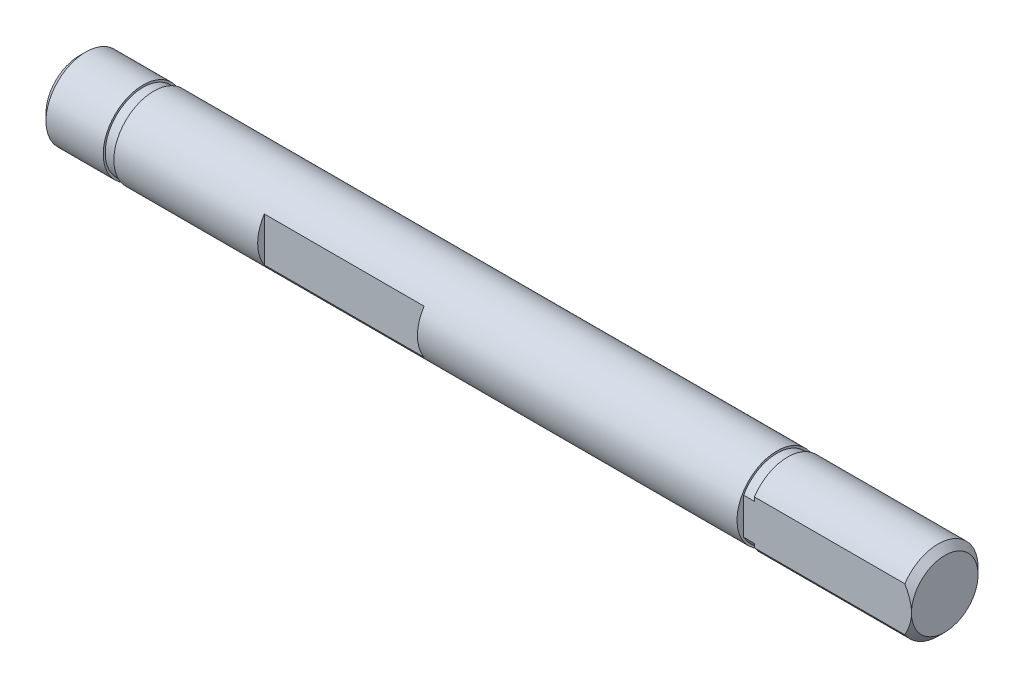
ISO-10303-21;
HEADER;
FILE_DESCRIPTION(('STEP AP214'),'2;1');
FILE_NAME('part.step','',(''),(''),'','','');
FILE_SCHEMA(('AUTOMOTIVE_DESIGN { 1 0 10303 214 1 1 1 1 }'));
ENDSEC;
DATA;
#1=APPLICATION_CONTEXT('core data for automotive mechanical design processes');
#2=APPLICATION_PROTOCOL_DEFINITION('international standard','automotive_design',2000,#1);
#3=PRODUCT_CONTEXT('',#1,'mechanical');
#4=PRODUCT('Part','Part','',(#3));
#5=PRODUCT_RELATED_PRODUCT_CATEGORY('part','',(#4));
#6=PRODUCT_DEFINITION_FORMATION('','',#4);
#7=PRODUCT_DEFINITION_CONTEXT('part definition',#1,'design');
#8=PRODUCT_DEFINITION('design','',#6,#7);
#9=PRODUCT_DEFINITION_SHAPE('','',#8);
#10=(LENGTH_UNIT() NAMED_UNIT(*) SI_UNIT(.MILLI.,.METRE.));
#11=(NAMED_UNIT(*) PLANE_ANGLE_UNIT() SI_UNIT($,.RADIAN.));
#12=(NAMED_UNIT(*) SI_UNIT($,.STERADIAN.) SOLID_ANGLE_UNIT());
#13=UNCERTAINTY_MEASURE_WITH_UNIT(LENGTH_MEASURE(1.E-05),#10,'distance_accuracy_value','');
#14=(GEOMETRIC_REPRESENTATION_CONTEXT(3) GLOBAL_UNCERTAINTY_ASSIGNED_CONTEXT((#13)) GLOBAL_UNIT_ASSIGNED_CONTEXT((#10,
#11,#12)) REPRESENTATION_CONTEXT('',''));
#15=CARTESIAN_POINT('',(0.,0.,0.));
#16=DIRECTION('',(0.,0.,1.));
#17=DIRECTION('',(1.,0.,0.));
#18=AXIS2_PLACEMENT_3D('',#15,#16,#17);
#19=CARTESIAN_POINT('',(32.5,0.,0.));
#20=DIRECTION('',(1.,0.,0.));
#21=DIRECTION('',(0.,0.,-1.));
#22=AXIS2_PLACEMENT_3D('',#19,#20,#21);
#23=CYLINDRICAL_SURFACE('',#22,3.);
#24=CARTESIAN_POINT('',(-26.9,0.,0.));
#25=DIRECTION('',(1.,0.,0.));
#26=DIRECTION('',(0.,0.,-1.));
#27=AXIS2_PLACEMENT_3D('',#24,#25,#26);
#28=CIRCLE('',#27,3.);
#29=CARTESIAN_POINT('',(-26.9,0.,-3.));
#30=VERTEX_POINT('',#29);
#31=EDGE_CURVE('E177',#30,#30,#28,.T.);
#32=ORIENTED_EDGE('',*,*,#31,.T.);
#33=EDGE_LOOP('',(#32));
#34=FACE_BOUND('',#33,.T.);
#35=CARTESIAN_POINT('',(19.9,0.,0.));
#36=DIRECTION('',(1.,0.,0.));
#37=DIRECTION('',(0.,0.,-1.));
#38=AXIS2_PLACEMENT_3D('',#35,#36,#37);
#39=CIRCLE('',#38,3.);
#40=CARTESIAN_POINT('',(19.9,0.,-3.));
#41=VERTEX_POINT('',#40);
#42=EDGE_CURVE('E181',#41,#41,#39,.T.);
#43=ORIENTED_EDGE('',*,*,#42,.F.);
#44=EDGE_LOOP('',(#43));
#45=FACE_BOUND('',#44,.T.);
#46=CARTESIAN_POINT('',(-16.1,0.,0.));
#47=DIRECTION('',(1.,0.,0.));
#48=DIRECTION('',(0.,0.,-1.));
#49=AXIS2_PLACEMENT_3D('',#46,#47,#48);
#50=CIRCLE('',#49,3.);
#51=CARTESIAN_POINT('',(-16.1,1.65831239519321,2.49999999999773));
#52=VERTEX_POINT('',#51);
#53=CARTESIAN_POINT('',(-16.1,-1.65831239519321,2.49999999999773));
#54=VERTEX_POINT('',#53);
#55=EDGE_CURVE('E117',#52,#54,#50,.T.);
#56=ORIENTED_EDGE('',*,*,#55,.F.);
#57=DIRECTION('',(1.,0.,0.));
#58=VECTOR('',#57,1.);
#59=CARTESIAN_POINT('',(-16.1,1.65831239519321,2.49999999999773));
#60=LINE('',#59,#58);
#61=CARTESIAN_POINT('',(-4.10000000000001,1.65831239519321,2.49999999999773));
#62=VERTEX_POINT('',#61);
#63=EDGE_CURVE('E130',#52,#62,#60,.T.);
#64=ORIENTED_EDGE('',*,*,#63,.T.);
#65=CARTESIAN_POINT('',(-4.10000000000001,0.,0.));
#66=DIRECTION('',(1.,0.,0.));
#67=DIRECTION('',(0.,0.,-1.));
#68=AXIS2_PLACEMENT_3D('',#65,#66,#67);
#69=CIRCLE('',#68,3.);
#70=CARTESIAN_POINT('',(-4.10000000000001,-1.65831239518952,2.49999999999216));
#71=VERTEX_POINT('',#70);
#72=EDGE_CURVE('E133',#62,#71,#69,.T.);
#73=ORIENTED_EDGE('',*,*,#72,.T.);
#74=DIRECTION('',(1.,0.,0.));
#75=VECTOR('',#74,1.);
#76=CARTESIAN_POINT('',(-16.1,-1.65831239519321,2.49999999999773));
#77=LINE('',#76,#75);
#78=EDGE_CURVE('E128',#54,#71,#77,.T.);
#79=ORIENTED_EDGE('',*,*,#78,.F.);
#80=EDGE_LOOP('',(#56,#64,#73,#79));
#81=FACE_BOUND('',#80,.T.);
#82=ADVANCED_FACE('F55',(#34,#45,#81),#23,.T.);
#83=CARTESIAN_POINT('',(32.5,0.,0.));
#84=DIRECTION('',(-1.,0.,0.));
#85=DIRECTION('',(0.,0.,1.));
#86=AXIS2_PLACEMENT_3D('',#83,#84,#85);
#87=PLANE('',#86);
#88=CARTESIAN_POINT('',(32.5,0.,0.));
#89=DIRECTION('',(-1.,0.,0.));
#90=DIRECTION('',(0.,0.,1.));
#91=AXIS2_PLACEMENT_3D('',#88,#89,#90);
#92=CIRCLE('',#91,2.50000000000001);
#93=CARTESIAN_POINT('',(32.5,0.,2.5));
#94=VERTEX_POINT('',#93);
#95=EDGE_CURVE('E205',#94,#94,#92,.F.);
#96=ORIENTED_EDGE('',*,*,#95,.T.);
#97=EDGE_LOOP('',(#96));
#98=FACE_BOUND('',#97,.T.);
#99=ADVANCED_FACE('F224',(#98),#87,.F.);
#100=CARTESIAN_POINT('',(32.5,0.,0.));
#101=DIRECTION('',(1.,0.,0.));
#102=DIRECTION('',(0.,0.,-1.));
#103=AXIS2_PLACEMENT_3D('',#100,#101,#102);
#104=CYLINDRICAL_SURFACE('',#103,3.);
#105=CARTESIAN_POINT('',(20.7,0.,0.));
#106=DIRECTION('',(1.,0.,0.));
#107=DIRECTION('',(0.,0.,-1.));
#108=AXIS2_PLACEMENT_3D('',#105,#106,#107);
#109=CIRCLE('',#108,3.);
#110=CARTESIAN_POINT('',(20.7,-1.6583123951777,2.5));
#111=VERTEX_POINT('',#110);
#112=CARTESIAN_POINT('',(20.7,1.6583123951777,2.5));
#113=VERTEX_POINT('',#112);
#114=EDGE_CURVE('E193',#111,#113,#109,.T.);
#115=ORIENTED_EDGE('',*,*,#114,.T.);
#116=DIRECTION('',(1.,0.,0.));
#117=VECTOR('',#116,1.);
#118=CARTESIAN_POINT('',(16.5458980337503,1.6583123951777,2.5));
#119=LINE('',#118,#117);
#120=CARTESIAN_POINT('',(32.,1.6583123951777,2.5));
#121=VERTEX_POINT('',#120);
#122=EDGE_CURVE('E145',#113,#121,#119,.T.);
#123=ORIENTED_EDGE('',*,*,#122,.T.);
#124=CARTESIAN_POINT('',(32.,0.,0.));
#125=DIRECTION('',(-1.,0.,0.));
#126=DIRECTION('',(0.,0.,1.));
#127=AXIS2_PLACEMENT_3D('',#124,#125,#126);
#128=CIRCLE('',#127,3.);
#129=CARTESIAN_POINT('',(32.,-1.6583123951777,2.5));
#130=VERTEX_POINT('',#129);
#131=EDGE_CURVE('E208',#121,#130,#128,.T.);
#132=ORIENTED_EDGE('',*,*,#131,.T.);
#133=DIRECTION('',(1.,0.,0.));
#134=VECTOR('',#133,1.);
#135=CARTESIAN_POINT('',(16.5458980337503,-1.6583123951777,2.5));
#136=LINE('',#135,#134);
#137=EDGE_CURVE('E149',#111,#130,#136,.T.);
#138=ORIENTED_EDGE('',*,*,#137,.F.);
#139=EDGE_LOOP('',(#115,#123,#132,#138));
#140=FACE_BOUND('',#139,.T.);
#141=ADVANCED_FACE('F221',(#140),#104,.T.);
#142=CARTESIAN_POINT('',(20.7,0.,3.));
#143=DIRECTION('',(1.,0.,0.));
#144=DIRECTION('',(0.,0.,-1.));
#145=AXIS2_PLACEMENT_3D('',#142,#143,#144);
#146=PLANE('',#145);
#147=ORIENTED_EDGE('',*,*,#114,.F.);
#148=DIRECTION('',(0.,1.,0.));
#149=VECTOR('',#148,1.);
#150=CARTESIAN_POINT('',(20.7,0.,2.5));
#151=LINE('',#150,#149);
#152=CARTESIAN_POINT('',(20.7,-1.3683932183404,2.5));
#153=VERTEX_POINT('',#152);
#154=EDGE_CURVE('E156',#111,#153,#151,.T.);
#155=ORIENTED_EDGE('',*,*,#154,.T.);
#156=CARTESIAN_POINT('',(20.7,0.,0.));
#157=DIRECTION('',(1.,0.,0.));
#158=DIRECTION('',(0.,0.,-1.));
#159=AXIS2_PLACEMENT_3D('',#156,#157,#158);
#160=CIRCLE('',#159,2.85);
#161=CARTESIAN_POINT('',(20.7,1.3683932183404,2.5));
#162=VERTEX_POINT('',#161);
#163=EDGE_CURVE('E189',#153,#162,#160,.T.);
#164=ORIENTED_EDGE('',*,*,#163,.T.);
#165=EDGE_CURVE('E161',#162,#113,#151,.T.);
#166=ORIENTED_EDGE('',*,*,#165,.T.);
#167=EDGE_LOOP('',(#147,#155,#164,#166));
#168=FACE_BOUND('',#167,.T.);
#169=ADVANCED_FACE('F231',(#168),#146,.F.);
#170=CARTESIAN_POINT('',(32.5,0.,0.));
#171=DIRECTION('',(1.,0.,0.));
#172=DIRECTION('',(0.,0.,-1.));
#173=AXIS2_PLACEMENT_3D('',#170,#171,#172);
#174=CYLINDRICAL_SURFACE('',#173,2.85);
#175=CARTESIAN_POINT('',(19.9,0.,0.));
#176=DIRECTION('',(1.,0.,0.));
#177=DIRECTION('',(0.,0.,-1.));
#178=AXIS2_PLACEMENT_3D('',#175,#176,#177);
#179=CIRCLE('',#178,2.85);
#180=CARTESIAN_POINT('',(19.9,-1.3683932183404,2.5));
#181=VERTEX_POINT('',#180);
#182=CARTESIAN_POINT('',(19.9,1.3683932183404,2.5));
#183=VERTEX_POINT('',#182);
#184=EDGE_CURVE('E185',#181,#183,#179,.T.);
#185=ORIENTED_EDGE('',*,*,#184,.T.);
#186=DIRECTION('',(1.,0.,0.));
#187=VECTOR('',#186,1.);
#188=CARTESIAN_POINT('',(32.5,1.3683932183404,2.5));
#189=LINE('',#188,#187);
#190=EDGE_CURVE('E160',#183,#162,#189,.T.);
#191=ORIENTED_EDGE('',*,*,#190,.T.);
#192=ORIENTED_EDGE('',*,*,#163,.F.);
#193=DIRECTION('',(1.,0.,0.));
#194=VECTOR('',#193,1.);
#195=CARTESIAN_POINT('',(32.5,-1.3683932183404,2.5));
#196=LINE('',#195,#194);
#197=EDGE_CURVE('E152',#153,#181,#196,.F.);
#198=ORIENTED_EDGE('',*,*,#197,.T.);
#199=EDGE_LOOP('',(#185,#191,#192,#198));
#200=FACE_BOUND('',#199,.T.);
#201=ADVANCED_FACE('F278',(#200),#174,.T.);
#202=CARTESIAN_POINT('',(19.9,0.,2.85));
#203=DIRECTION('',(-1.,0.,0.));
#204=DIRECTION('',(0.,0.,1.));
#205=AXIS2_PLACEMENT_3D('',#202,#203,#204);
#206=PLANE('',#205);
#207=ORIENTED_EDGE('',*,*,#184,.F.);
#208=DIRECTION('',(0.,1.,0.));
#209=VECTOR('',#208,1.);
#210=CARTESIAN_POINT('',(19.9,1.6583123951777,2.5));
#211=LINE('',#210,#209);
#212=EDGE_CURVE('E138',#181,#183,#211,.T.);
#213=ORIENTED_EDGE('',*,*,#212,.T.);
#214=EDGE_LOOP('',(#207,#213));
#215=FACE_BOUND('',#214,.T.);
#216=ORIENTED_EDGE('',*,*,#42,.T.);
#217=EDGE_LOOP('',(#216));
#218=FACE_BOUND('',#217,.T.);
#219=ADVANCED_FACE('F273',(#215,#218),#206,.F.);
#220=CARTESIAN_POINT('',(-26.9,0.,3.));
#221=DIRECTION('',(1.,0.,0.));
#222=DIRECTION('',(0.,0.,-1.));
#223=AXIS2_PLACEMENT_3D('',#220,#221,#222);
#224=PLANE('',#223);
#225=ORIENTED_EDGE('',*,*,#31,.F.);
#226=EDGE_LOOP('',(#225));
#227=FACE_BOUND('',#226,.T.);
#228=CARTESIAN_POINT('',(-26.9,0.,0.));
#229=DIRECTION('',(1.,0.,0.));
#230=DIRECTION('',(0.,0.,-1.));
#231=AXIS2_PLACEMENT_3D('',#228,#229,#230);
#232=CIRCLE('',#231,2.85);
#233=CARTESIAN_POINT('',(-26.9,0.,-2.85));
#234=VERTEX_POINT('',#233);
#235=EDGE_CURVE('E173',#234,#234,#232,.T.);
#236=ORIENTED_EDGE('',*,*,#235,.T.);
#237=EDGE_LOOP('',(#236));
#238=FACE_BOUND('',#237,.T.);
#239=ADVANCED_FACE('F267',(#227,#238),#224,.F.);
#240=CARTESIAN_POINT('',(32.5,0.,0.));
#241=DIRECTION('',(1.,0.,0.));
#242=DIRECTION('',(0.,0.,-1.));
#243=AXIS2_PLACEMENT_3D('',#240,#241,#242);
#244=CYLINDRICAL_SURFACE('',#243,2.85);
#245=ORIENTED_EDGE('',*,*,#235,.F.);
#246=EDGE_LOOP('',(#245));
#247=FACE_BOUND('',#246,.T.);
#248=CARTESIAN_POINT('',(-27.7,0.,0.));
#249=DIRECTION('',(1.,0.,0.));
#250=DIRECTION('',(0.,0.,-1.));
#251=AXIS2_PLACEMENT_3D('',#248,#249,#250);
#252=CIRCLE('',#251,2.85);
#253=CARTESIAN_POINT('',(-27.7,0.,-2.85));
#254=VERTEX_POINT('',#253);
#255=EDGE_CURVE('E169',#254,#254,#252,.T.);
#256=ORIENTED_EDGE('',*,*,#255,.T.);
#257=EDGE_LOOP('',(#256));
#258=FACE_BOUND('',#257,.T.);
#259=ADVANCED_FACE('F261',(#247,#258),#244,.T.);
#260=CARTESIAN_POINT('',(-27.7,0.,2.85));
#261=DIRECTION('',(-1.,0.,0.));
#262=DIRECTION('',(0.,0.,1.));
#263=AXIS2_PLACEMENT_3D('',#260,#261,#262);
#264=PLANE('',#263);
#265=ORIENTED_EDGE('',*,*,#255,.F.);
#266=EDGE_LOOP('',(#265));
#267=FACE_BOUND('',#266,.T.);
#268=CARTESIAN_POINT('',(-27.7,0.,0.));
#269=DIRECTION('',(1.,0.,0.));
#270=DIRECTION('',(0.,0.,-1.));
#271=AXIS2_PLACEMENT_3D('',#268,#269,#270);
#272=CIRCLE('',#271,3.);
#273=CARTESIAN_POINT('',(-27.7,0.,-3.));
#274=VERTEX_POINT('',#273);
#275=EDGE_CURVE('E165',#274,#274,#272,.T.);
#276=ORIENTED_EDGE('',*,*,#275,.T.);
#277=EDGE_LOOP('',(#276));
#278=FACE_BOUND('',#277,.T.);
#279=ADVANCED_FACE('F256',(#267,#278),#264,.F.);
#280=CARTESIAN_POINT('',(32.5,0.,0.));
#281=DIRECTION('',(1.,0.,0.));
#282=DIRECTION('',(0.,0.,-1.));
#283=AXIS2_PLACEMENT_3D('',#280,#281,#282);
#284=CYLINDRICAL_SURFACE('',#283,3.);
#285=CARTESIAN_POINT('',(-32.,0.,0.));
#286=DIRECTION('',(1.,0.,0.));
#287=DIRECTION('',(0.,0.,-1.));
#288=AXIS2_PLACEMENT_3D('',#285,#286,#287);
#289=CIRCLE('',#288,3.);
#290=CARTESIAN_POINT('',(-32.,0.,-3.));
#291=VERTEX_POINT('',#290);
#292=EDGE_CURVE('E197',#291,#291,#289,.T.);
#293=ORIENTED_EDGE('',*,*,#292,.T.);
#294=EDGE_LOOP('',(#293));
#295=FACE_BOUND('',#294,.T.);
#296=ORIENTED_EDGE('',*,*,#275,.F.);
#297=EDGE_LOOP('',(#296));
#298=FACE_BOUND('',#297,.T.);
#299=ADVANCED_FACE('F247',(#295,#298),#284,.T.);
#300=CARTESIAN_POINT('',(-32.5,0.,3.));
#301=DIRECTION('',(1.,0.,0.));
#302=DIRECTION('',(0.,0.,-1.));
#303=AXIS2_PLACEMENT_3D('',#300,#301,#302);
#304=PLANE('',#303);
#305=CARTESIAN_POINT('',(-32.5,0.,0.));
#306=DIRECTION('',(1.,0.,0.));
#307=DIRECTION('',(0.,0.,-1.));
#308=AXIS2_PLACEMENT_3D('',#305,#306,#307);
#309=CIRCLE('',#308,2.50000000000001);
#310=CARTESIAN_POINT('',(-32.5,0.,-2.50000000000001));
#311=VERTEX_POINT('',#310);
#312=EDGE_CURVE('E201',#311,#311,#309,.F.);
#313=ORIENTED_EDGE('',*,*,#312,.T.);
#314=EDGE_LOOP('',(#313));
#315=FACE_BOUND('',#314,.T.);
#316=ADVANCED_FACE('F241',(#315),#304,.F.);
#317=CARTESIAN_POINT('',(-32.,0.,0.));
#318=DIRECTION('',(1.,0.,0.));
#319=DIRECTION('',(0.,0.,-1.));
#320=AXIS2_PLACEMENT_3D('',#317,#318,#319);
#321=CONICAL_SURFACE('',#320,3.,0.785398163397439);
#322=ORIENTED_EDGE('',*,*,#312,.F.);
#323=EDGE_LOOP('',(#322));
#324=FACE_BOUND('',#323,.T.);
#325=ORIENTED_EDGE('',*,*,#292,.F.);
#326=EDGE_LOOP('',(#325));
#327=FACE_BOUND('',#326,.T.);
#328=ADVANCED_FACE('F238',(#324,#327),#321,.T.);
#329=CARTESIAN_POINT('',(32.5,0.,0.));
#330=DIRECTION('',(-1.,0.,0.));
#331=DIRECTION('',(0.,0.,1.));
#332=AXIS2_PLACEMENT_3D('',#329,#330,#331);
#333=CONICAL_SURFACE('',#332,2.50000000000001,0.785398163397446);
#334=CARTESIAN_POINT('',(29.398544587664,-5.01261436142739,2.5));
#335=CARTESIAN_POINT('',(29.5292961898361,-4.86645601073502,2.5));
#336=CARTESIAN_POINT('',(29.6594638313862,-4.71976739212954,2.5));
#337=CARTESIAN_POINT('',(29.9182043366285,-4.42490323608814,2.5));
#338=CARTESIAN_POINT('',(30.0467766411769,-4.27672720851474,2.5));
#339=CARTESIAN_POINT('',(30.3032395004086,-3.97688951525238,2.5));
#340=CARTESIAN_POINT('',(30.4311062482401,-3.82520739562327,2.5));
#341=CARTESIAN_POINT('',(30.6206791885024,-3.595871572483,2.5));
#342=CARTESIAN_POINT('',(30.683492074651,-3.51913287021474,2.5));
#343=CARTESIAN_POINT('',(30.8082494078657,-3.36494027001334,2.5));
#344=CARTESIAN_POINT('',(30.870193765036,-3.28748629940354,2.5));
#345=CARTESIAN_POINT('',(31.0460483302526,-3.06459082343304,2.5));
#346=CARTESIAN_POINT('',(31.1586894981081,-2.918139073523,2.5));
#347=CARTESIAN_POINT('',(31.3788996641048,-2.62149769559914,2.5));
#348=CARTESIAN_POINT('',(31.4864696419384,-2.47130879819325,2.5));
#349=CARTESIAN_POINT('',(31.6940169575574,-2.1661218251349,2.5));
#350=CARTESIAN_POINT('',(31.79400938781,-2.01113422400732,2.5));
#351=CARTESIAN_POINT('',(31.9354107270732,-1.77361367684962,2.5));
#352=CARTESIAN_POINT('',(31.9810970794498,-1.69363260464492,2.5));
#353=CARTESIAN_POINT('',(32.0688677372138,-1.53172298488922,2.5));
#354=CARTESIAN_POINT('',(32.1109528053295,-1.44979485443241,2.5));
#355=CARTESIAN_POINT('',(32.1878183587141,-1.2895548575869,2.5));
#356=CARTESIAN_POINT('',(32.2229037691546,-1.21139031158108,2.5));
#357=CARTESIAN_POINT('',(32.288230570901,-1.0530403527511,2.5));
#358=CARTESIAN_POINT('',(32.3184719361588,-0.972854929062676,2.5));
#359=CARTESIAN_POINT('',(32.3729031977163,-0.810820527838589,2.5));
#360=CARTESIAN_POINT('',(32.3971190319419,-0.728980380152467,2.5));
#361=CARTESIAN_POINT('',(32.4385195500288,-0.56354770981411,2.5));
#362=CARTESIAN_POINT('',(32.4557071011351,-0.479955916420267,2.5));
#363=CARTESIAN_POINT('',(32.4822646083775,-0.310064383761596,2.5));
#364=CARTESIAN_POINT('',(32.4914974735762,-0.223742755772695,2.5));
#365=CARTESIAN_POINT('',(32.5009812764121,-0.0506093366639135,2.5));
#366=CARTESIAN_POINT('',(32.5012334603241,0.036202384771989,2.5));
#367=CARTESIAN_POINT('',(32.4927321484853,0.209521762519664,2.5));
#368=CARTESIAN_POINT('',(32.4839634825484,0.296028660341513,2.5));
#369=CARTESIAN_POINT('',(32.4580338915021,0.467771425777332,2.5));
#370=CARTESIAN_POINT('',(32.4408705066054,0.553006913299487,2.5));
#371=CARTESIAN_POINT('',(32.3938594777731,0.743317468333311,2.5));
#372=CARTESIAN_POINT('',(32.3618857477942,0.847862483412481,2.5));
#373=CARTESIAN_POINT('',(32.2887422005433,1.05365832245557,2.5));
#374=CARTESIAN_POINT('',(32.2475678392536,1.15490749025702,2.5));
#375=CARTESIAN_POINT('',(32.157667077102,1.35535095839265,2.5));
#376=CARTESIAN_POINT('',(32.1088593227964,1.45450827052724,2.5));
#377=CARTESIAN_POINT('',(32.0058001956106,1.64988097548418,2.5));
#378=CARTESIAN_POINT('',(31.9515503446908,1.74609718106251,2.5));
#379=CARTESIAN_POINT('',(31.8060900856274,1.99142704465442,2.5));
#380=CARTESIAN_POINT('',(31.7117668982661,2.13868543535028,2.5));
#381=CARTESIAN_POINT('',(31.516233566657,2.42858701671751,2.5));
#382=CARTESIAN_POINT('',(31.4150198225451,2.57122773664605,2.5));
#383=CARTESIAN_POINT('',(31.2076005635745,2.85332108896259,2.5));
#384=CARTESIAN_POINT('',(31.1013840508023,2.99276558976195,2.5));
#385=CARTESIAN_POINT('',(30.8855313873053,3.26898529959981,2.5));
#386=CARTESIAN_POINT('',(30.7758949548956,3.40576028724492,2.5));
#387=CARTESIAN_POINT('',(30.5623603367655,3.66713566496964,2.5));
#388=CARTESIAN_POINT('',(30.4586428413258,3.79188417485755,2.5));
#389=CARTESIAN_POINT('',(30.2495294376333,4.03997782587897,2.5));
#390=CARTESIAN_POINT('',(30.1441334188187,4.16332287364347,2.5));
#391=CARTESIAN_POINT('',(29.9326215107457,4.40818765481885,2.5));
#392=CARTESIAN_POINT('',(29.8265129639386,4.52971374327953,2.5));
#393=CARTESIAN_POINT('',(29.6132532405992,4.77182042249176,2.5));
#394=CARTESIAN_POINT('',(29.5061022001604,4.89240113304365,2.5));
#395=CARTESIAN_POINT('',(29.398544587664,5.01261436142739,2.5));
#396=B_SPLINE_CURVE_WITH_KNOTS('',3,(#334,#335,#336,#337,#338,#339,#340,#341,#342,#343,#344,
#345,#346,#347,#348,#349,#350,#351,#352,#353,#354,#355,#356,#357,#358,#359,#360,#361,#362,#363,
#364,#365,#366,#367,#368,#369,#370,#371,#372,#373,#374,#375,#376,#377,#378,#379,#380,#381,#382,
#383,#384,#385,#386,#387,#388,#389,#390,#391,#392,#393,#394,#395),.UNSPECIFIED.,.F.,.F.,(4,2,2,
2,2,2,2,2,2,2,2,2,2,2,2,2,2,2,2,2,2,2,2,2,2,2,2,2,2,2,4),(0.,0.588329986418013,1.17686065921619,
1.7719900012701,2.06948816889885,2.36701690466703,2.92121182530219,3.4752992397552,
4.02825235410281,4.30451265967417,4.58071430956072,4.83761667037544,5.09452041259708,
5.35029835461554,5.60597184559848,5.86596818653905,6.12592844690954,6.38632659311144,
6.64680108589984,6.97420780536844,7.30177658362051,7.63310993802625,7.96435088727155,
8.48865866228505,9.01324248750299,9.5390389141824,10.0648787635413,10.5515594246363,
11.0382722763362,11.5222580103924,12.006181387876),.UNSPECIFIED.);
#397=EDGE_CURVE('E13',#130,#94,#396,.T.);
#398=ORIENTED_EDGE('',*,*,#397,.F.);
#399=ORIENTED_EDGE('',*,*,#131,.F.);
#400=EDGE_CURVE('E61',#94,#121,#396,.T.);
#401=ORIENTED_EDGE('',*,*,#400,.F.);
#402=ORIENTED_EDGE('',*,*,#95,.F.);
#403=EDGE_LOOP('',(#398,#399,#401,#402));
#404=FACE_BOUND('',#403,.T.);
#405=ADVANCED_FACE('F58',(#404),#333,.T.);
#406=CARTESIAN_POINT('',(16.5458980337503,1.6583123951777,2.5));
#407=DIRECTION('',(0.,0.,-1.));
#408=DIRECTION('',(-1.,0.,0.));
#409=AXIS2_PLACEMENT_3D('',#406,#407,#408);
#410=PLANE('',#409);
#411=ORIENTED_EDGE('',*,*,#190,.F.);
#412=ORIENTED_EDGE('',*,*,#212,.F.);
#413=ORIENTED_EDGE('',*,*,#197,.F.);
#414=ORIENTED_EDGE('',*,*,#154,.F.);
#415=ORIENTED_EDGE('',*,*,#137,.T.);
#416=ORIENTED_EDGE('',*,*,#397,.T.);
#417=ORIENTED_EDGE('',*,*,#400,.T.);
#418=ORIENTED_EDGE('',*,*,#122,.F.);
#419=ORIENTED_EDGE('',*,*,#165,.F.);
#420=EDGE_LOOP('',(#411,#412,#413,#414,#415,#416,#417,#418,#419));
#421=FACE_BOUND('',#420,.T.);
#422=ADVANCED_FACE('F217',(#421),#410,.F.);
#423=CARTESIAN_POINT('',(-16.1,-291595.6,2.49999999999773));
#424=DIRECTION('',(0.,0.,-1.));
#425=DIRECTION('',(-1.,0.,0.));
#426=AXIS2_PLACEMENT_3D('',#423,#424,#425);
#427=PLANE('',#426);
#428=DIRECTION('',(0.,1.,0.));
#429=VECTOR('',#428,1.);
#430=CARTESIAN_POINT('',(-4.10000000000001,-291595.6,2.49999999999773));
#431=LINE('',#430,#429);
#432=EDGE_CURVE('E77',#71,#62,#431,.T.);
#433=ORIENTED_EDGE('',*,*,#432,.T.);
#434=ORIENTED_EDGE('',*,*,#63,.F.);
#435=DIRECTION('',(0.,1.,0.));
#436=VECTOR('',#435,1.);
#437=CARTESIAN_POINT('',(-16.1,-291595.6,2.49999999999773));
#438=LINE('',#437,#436);
#439=EDGE_CURVE('E120',#54,#52,#438,.T.);
#440=ORIENTED_EDGE('',*,*,#439,.F.);
#441=ORIENTED_EDGE('',*,*,#78,.T.);
#442=EDGE_LOOP('',(#433,#434,#440,#441));
#443=FACE_BOUND('',#442,.T.);
#444=ADVANCED_FACE('F127',(#443),#427,.F.);
#445=CARTESIAN_POINT('',(-16.1,0.,0.));
#446=DIRECTION('',(1.,0.,0.));
#447=DIRECTION('',(0.,0.,-1.));
#448=AXIS2_PLACEMENT_3D('',#445,#446,#447);
#449=PLANE('',#448);
#450=ORIENTED_EDGE('',*,*,#55,.T.);
#451=ORIENTED_EDGE('',*,*,#439,.T.);
#452=EDGE_LOOP('',(#450,#451));
#453=FACE_BOUND('',#452,.T.);
#454=ADVANCED_FACE('F119',(#453),#449,.T.);
#455=CARTESIAN_POINT('',(-4.10000000000001,0.,0.));
#456=DIRECTION('',(1.,0.,0.));
#457=DIRECTION('',(0.,0.,-1.));
#458=AXIS2_PLACEMENT_3D('',#455,#456,#457);
#459=PLANE('',#458);
#460=ORIENTED_EDGE('',*,*,#72,.F.);
#461=ORIENTED_EDGE('',*,*,#432,.F.);
#462=EDGE_LOOP('',(#460,#461));
#463=FACE_BOUND('',#462,.T.);
#464=ADVANCED_FACE('F350',(#463),#459,.F.);
#465=CLOSED_SHELL('',(#82,#99,#141,#169,#201,#219,#239,#259,#279,#299,#316,#328,#405,#422,#444,
#454,#464));
#466=MANIFOLD_SOLID_BREP('B2',#465);
#467=ADVANCED_BREP_SHAPE_REPRESENTATION('',(#18,#466),#14);
#468=SHAPE_DEFINITION_REPRESENTATION(#9,#467);
ENDSEC;
END-ISO-10303-21;
